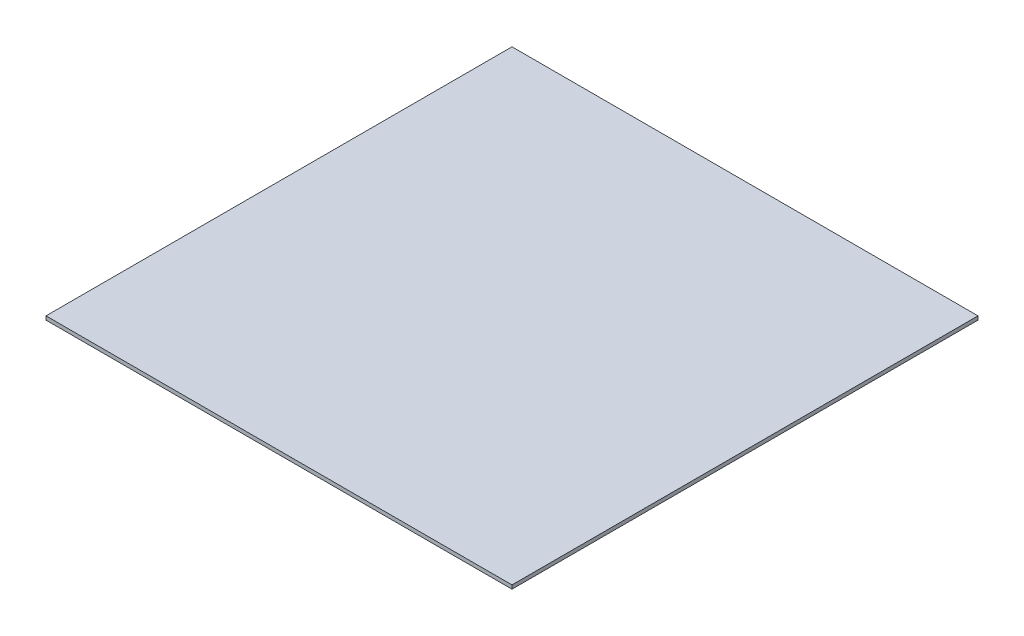
ISO-10303-21;
HEADER;
FILE_DESCRIPTION(('STEP AP214'),'2;1');
FILE_NAME('part.step','',(''),(''),'','','');
FILE_SCHEMA(('AUTOMOTIVE_DESIGN { 1 0 10303 214 1 1 1 1 }'));
ENDSEC;
DATA;
#1=APPLICATION_CONTEXT('core data for automotive mechanical design processes');
#2=APPLICATION_PROTOCOL_DEFINITION('international standard','automotive_design',2000,#1);
#3=PRODUCT_CONTEXT('',#1,'mechanical');
#4=PRODUCT('Part','Part','',(#3));
#5=PRODUCT_RELATED_PRODUCT_CATEGORY('part','',(#4));
#6=PRODUCT_DEFINITION_FORMATION('','',#4);
#7=PRODUCT_DEFINITION_CONTEXT('part definition',#1,'design');
#8=PRODUCT_DEFINITION('design','',#6,#7);
#9=PRODUCT_DEFINITION_SHAPE('','',#8);
#10=(LENGTH_UNIT() NAMED_UNIT(*) SI_UNIT(.MILLI.,.METRE.));
#11=(NAMED_UNIT(*) PLANE_ANGLE_UNIT() SI_UNIT($,.RADIAN.));
#12=(NAMED_UNIT(*) SI_UNIT($,.STERADIAN.) SOLID_ANGLE_UNIT());
#13=UNCERTAINTY_MEASURE_WITH_UNIT(LENGTH_MEASURE(1.E-05),#10,'distance_accuracy_value','');
#14=(GEOMETRIC_REPRESENTATION_CONTEXT(3) GLOBAL_UNCERTAINTY_ASSIGNED_CONTEXT((#13)) GLOBAL_UNIT_ASSIGNED_CONTEXT((#10,
#11,#12)) REPRESENTATION_CONTEXT('',''));
#15=CARTESIAN_POINT('',(0.,0.,0.));
#16=DIRECTION('',(0.,0.,1.));
#17=DIRECTION('',(1.,0.,0.));
#18=AXIS2_PLACEMENT_3D('',#15,#16,#17);
#19=CARTESIAN_POINT('',(0.,0.4,0.));
#20=DIRECTION('',(1.,0.,0.));
#21=DIRECTION('',(0.,0.,-1.));
#22=AXIS2_PLACEMENT_3D('',#19,#20,#21);
#23=PLANE('',#22);
#24=DIRECTION('',(0.,0.,1.));
#25=VECTOR('',#24,1.);
#26=CARTESIAN_POINT('',(0.,0.,0.));
#27=LINE('',#26,#25);
#28=CARTESIAN_POINT('',(0.,0.,-50.));
#29=VERTEX_POINT('',#28);
#30=CARTESIAN_POINT('',(0.,0.,0.));
#31=VERTEX_POINT('',#30);
#32=EDGE_CURVE('E102',#29,#31,#27,.T.);
#33=ORIENTED_EDGE('',*,*,#32,.T.);
#34=DIRECTION('',(0.,-1.,0.));
#35=VECTOR('',#34,1.);
#36=CARTESIAN_POINT('',(0.,0.4,0.));
#37=LINE('',#36,#35);
#38=CARTESIAN_POINT('',(0.,0.4,0.));
#39=VERTEX_POINT('',#38);
#40=EDGE_CURVE('E11',#39,#31,#37,.T.);
#41=ORIENTED_EDGE('',*,*,#40,.F.);
#42=DIRECTION('',(0.,0.,1.));
#43=VECTOR('',#42,1.);
#44=CARTESIAN_POINT('',(0.,0.4,0.));
#45=LINE('',#44,#43);
#46=CARTESIAN_POINT('',(0.,0.4,-50.));
#47=VERTEX_POINT('',#46);
#48=EDGE_CURVE('E90',#47,#39,#45,.T.);
#49=ORIENTED_EDGE('',*,*,#48,.F.);
#50=DIRECTION('',(0.,-1.,0.));
#51=VECTOR('',#50,1.);
#52=CARTESIAN_POINT('',(0.,0.4,-50.));
#53=LINE('',#52,#51);
#54=EDGE_CURVE('E98',#47,#29,#53,.T.);
#55=ORIENTED_EDGE('',*,*,#54,.T.);
#56=EDGE_LOOP('',(#33,#41,#49,#55));
#57=FACE_BOUND('',#56,.T.);
#58=ADVANCED_FACE('F39',(#57),#23,.F.);
#59=CARTESIAN_POINT('',(0.,0.4,0.));
#60=DIRECTION('',(0.,0.,-1.));
#61=DIRECTION('',(-1.,0.,0.));
#62=AXIS2_PLACEMENT_3D('',#59,#60,#61);
#63=PLANE('',#62);
#64=DIRECTION('',(1.,0.,0.));
#65=VECTOR('',#64,1.);
#66=CARTESIAN_POINT('',(0.,0.,0.));
#67=LINE('',#66,#65);
#68=CARTESIAN_POINT('',(50.,0.,0.));
#69=VERTEX_POINT('',#68);
#70=EDGE_CURVE('E94',#31,#69,#67,.T.);
#71=ORIENTED_EDGE('',*,*,#70,.T.);
#72=DIRECTION('',(0.,-1.,0.));
#73=VECTOR('',#72,1.);
#74=CARTESIAN_POINT('',(50.,0.4,0.));
#75=LINE('',#74,#73);
#76=CARTESIAN_POINT('',(50.,0.4,0.));
#77=VERTEX_POINT('',#76);
#78=EDGE_CURVE('E47',#77,#69,#75,.T.);
#79=ORIENTED_EDGE('',*,*,#78,.F.);
#80=DIRECTION('',(1.,0.,0.));
#81=VECTOR('',#80,1.);
#82=CARTESIAN_POINT('',(0.,0.4,0.));
#83=LINE('',#82,#81);
#84=EDGE_CURVE('E85',#39,#77,#83,.T.);
#85=ORIENTED_EDGE('',*,*,#84,.F.);
#86=ORIENTED_EDGE('',*,*,#40,.T.);
#87=EDGE_LOOP('',(#71,#79,#85,#86));
#88=FACE_BOUND('',#87,.T.);
#89=ADVANCED_FACE('F93',(#88),#63,.F.);
#90=CARTESIAN_POINT('',(50.,0.4,0.));
#91=DIRECTION('',(-1.,0.,0.));
#92=DIRECTION('',(0.,0.,1.));
#93=AXIS2_PLACEMENT_3D('',#90,#91,#92);
#94=PLANE('',#93);
#95=DIRECTION('',(0.,0.,-1.));
#96=VECTOR('',#95,1.);
#97=CARTESIAN_POINT('',(50.,0.,0.));
#98=LINE('',#97,#96);
#99=CARTESIAN_POINT('',(50.,0.,-50.));
#100=VERTEX_POINT('',#99);
#101=EDGE_CURVE('E72',#69,#100,#98,.T.);
#102=ORIENTED_EDGE('',*,*,#101,.T.);
#103=DIRECTION('',(0.,-1.,0.));
#104=VECTOR('',#103,1.);
#105=CARTESIAN_POINT('',(50.,0.4,-50.));
#106=LINE('',#105,#104);
#107=CARTESIAN_POINT('',(50.,0.4,-50.));
#108=VERTEX_POINT('',#107);
#109=EDGE_CURVE('E95',#108,#100,#106,.T.);
#110=ORIENTED_EDGE('',*,*,#109,.F.);
#111=DIRECTION('',(0.,0.,-1.));
#112=VECTOR('',#111,1.);
#113=CARTESIAN_POINT('',(50.,0.4,0.));
#114=LINE('',#113,#112);
#115=EDGE_CURVE('E88',#77,#108,#114,.T.);
#116=ORIENTED_EDGE('',*,*,#115,.F.);
#117=ORIENTED_EDGE('',*,*,#78,.T.);
#118=EDGE_LOOP('',(#102,#110,#116,#117));
#119=FACE_BOUND('',#118,.T.);
#120=ADVANCED_FACE('F96',(#119),#94,.F.);
#121=CARTESIAN_POINT('',(0.,0.4,-50.));
#122=DIRECTION('',(0.,0.,1.));
#123=DIRECTION('',(1.,0.,0.));
#124=AXIS2_PLACEMENT_3D('',#121,#122,#123);
#125=PLANE('',#124);
#126=DIRECTION('',(-1.,0.,0.));
#127=VECTOR('',#126,1.);
#128=CARTESIAN_POINT('',(0.,0.,-50.));
#129=LINE('',#128,#127);
#130=EDGE_CURVE('E78',#100,#29,#129,.T.);
#131=ORIENTED_EDGE('',*,*,#130,.T.);
#132=ORIENTED_EDGE('',*,*,#54,.F.);
#133=DIRECTION('',(-1.,0.,0.));
#134=VECTOR('',#133,1.);
#135=CARTESIAN_POINT('',(0.,0.4,-50.));
#136=LINE('',#135,#134);
#137=EDGE_CURVE('E55',#108,#47,#136,.T.);
#138=ORIENTED_EDGE('',*,*,#137,.F.);
#139=ORIENTED_EDGE('',*,*,#109,.T.);
#140=EDGE_LOOP('',(#131,#132,#138,#139));
#141=FACE_BOUND('',#140,.T.);
#142=ADVANCED_FACE('F109',(#141),#125,.F.);
#143=CARTESIAN_POINT('',(0.,0.4,0.));
#144=DIRECTION('',(0.,-1.,0.));
#145=DIRECTION('',(0.,0.,-1.));
#146=AXIS2_PLACEMENT_3D('',#143,#144,#145);
#147=PLANE('',#146);
#148=ORIENTED_EDGE('',*,*,#48,.T.);
#149=ORIENTED_EDGE('',*,*,#84,.T.);
#150=ORIENTED_EDGE('',*,*,#115,.T.);
#151=ORIENTED_EDGE('',*,*,#137,.T.);
#152=EDGE_LOOP('',(#148,#149,#150,#151));
#153=FACE_BOUND('',#152,.T.);
#154=ADVANCED_FACE('F86',(#153),#147,.F.);
#155=CARTESIAN_POINT('',(0.,0.,0.));
#156=DIRECTION('',(0.,-1.,0.));
#157=DIRECTION('',(0.,0.,-1.));
#158=AXIS2_PLACEMENT_3D('',#155,#156,#157);
#159=PLANE('',#158);
#160=ORIENTED_EDGE('',*,*,#32,.F.);
#161=ORIENTED_EDGE('',*,*,#130,.F.);
#162=ORIENTED_EDGE('',*,*,#101,.F.);
#163=ORIENTED_EDGE('',*,*,#70,.F.);
#164=EDGE_LOOP('',(#160,#161,#162,#163));
#165=FACE_BOUND('',#164,.T.);
#166=ADVANCED_FACE('F112',(#165),#159,.T.);
#167=CLOSED_SHELL('',(#58,#89,#120,#142,#154,#166));
#168=MANIFOLD_SOLID_BREP('B2',#167);
#169=ADVANCED_BREP_SHAPE_REPRESENTATION('',(#18,#168),#14);
#170=SHAPE_DEFINITION_REPRESENTATION(#9,#169);
ENDSEC;
END-ISO-10303-21;
